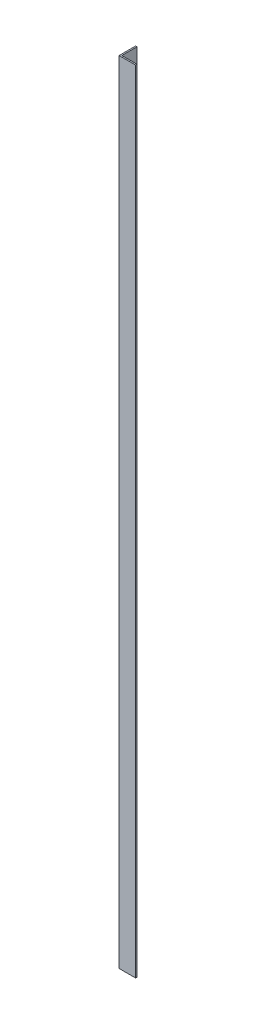
ISO-10303-21;
HEADER;
FILE_DESCRIPTION(('STEP AP214'),'2;1');
FILE_NAME('part.step','',(''),(''),'','','');
FILE_SCHEMA(('AUTOMOTIVE_DESIGN { 1 0 10303 214 1 1 1 1 }'));
ENDSEC;
DATA;
#1=APPLICATION_CONTEXT('core data for automotive mechanical design processes');
#2=APPLICATION_PROTOCOL_DEFINITION('international standard','automotive_design',2000,#1);
#3=PRODUCT_CONTEXT('',#1,'mechanical');
#4=PRODUCT('Part','Part','',(#3));
#5=PRODUCT_RELATED_PRODUCT_CATEGORY('part','',(#4));
#6=PRODUCT_DEFINITION_FORMATION('','',#4);
#7=PRODUCT_DEFINITION_CONTEXT('part definition',#1,'design');
#8=PRODUCT_DEFINITION('design','',#6,#7);
#9=PRODUCT_DEFINITION_SHAPE('','',#8);
#10=(LENGTH_UNIT() NAMED_UNIT(*) SI_UNIT(.MILLI.,.METRE.));
#11=(NAMED_UNIT(*) PLANE_ANGLE_UNIT() SI_UNIT($,.RADIAN.));
#12=(NAMED_UNIT(*) SI_UNIT($,.STERADIAN.) SOLID_ANGLE_UNIT());
#13=UNCERTAINTY_MEASURE_WITH_UNIT(LENGTH_MEASURE(1.E-05),#10,'distance_accuracy_value','');
#14=(GEOMETRIC_REPRESENTATION_CONTEXT(3) GLOBAL_UNCERTAINTY_ASSIGNED_CONTEXT((#13)) GLOBAL_UNIT_ASSIGNED_CONTEXT((#10,
#11,#12)) REPRESENTATION_CONTEXT('',''));
#15=CARTESIAN_POINT('',(0.,0.,0.));
#16=DIRECTION('',(0.,0.,1.));
#17=DIRECTION('',(1.,0.,0.));
#18=AXIS2_PLACEMENT_3D('',#15,#16,#17);
#19=CARTESIAN_POINT('',(0.,914.4,0.));
#20=DIRECTION('',(0.,0.,1.));
#21=DIRECTION('',(1.,0.,0.));
#22=AXIS2_PLACEMENT_3D('',#19,#20,#21);
#23=PLANE('',#22);
#24=DIRECTION('',(-1.,0.,0.));
#25=VECTOR('',#24,1.);
#26=CARTESIAN_POINT('',(0.,0.,0.));
#27=LINE('',#26,#25);
#28=CARTESIAN_POINT('',(1.5875,0.,0.));
#29=VERTEX_POINT('',#28);
#30=CARTESIAN_POINT('',(0.,0.,0.));
#31=VERTEX_POINT('',#30);
#32=EDGE_CURVE('E125',#29,#31,#27,.T.);
#33=ORIENTED_EDGE('',*,*,#32,.T.);
#34=DIRECTION('',(0.,-1.,0.));
#35=VECTOR('',#34,1.);
#36=CARTESIAN_POINT('',(0.,914.4,0.));
#37=LINE('',#36,#35);
#38=CARTESIAN_POINT('',(0.,914.4,0.));
#39=VERTEX_POINT('',#38);
#40=EDGE_CURVE('E11',#39,#31,#37,.T.);
#41=ORIENTED_EDGE('',*,*,#40,.F.);
#42=DIRECTION('',(-1.,0.,0.));
#43=VECTOR('',#42,1.);
#44=CARTESIAN_POINT('',(0.,914.4,0.));
#45=LINE('',#44,#43);
#46=CARTESIAN_POINT('',(1.5875,914.4,0.));
#47=VERTEX_POINT('',#46);
#48=EDGE_CURVE('E135',#47,#39,#45,.T.);
#49=ORIENTED_EDGE('',*,*,#48,.F.);
#50=DIRECTION('',(0.,-1.,0.));
#51=VECTOR('',#50,1.);
#52=CARTESIAN_POINT('',(1.5875,914.4,0.));
#53=LINE('',#52,#51);
#54=EDGE_CURVE('E121',#47,#29,#53,.T.);
#55=ORIENTED_EDGE('',*,*,#54,.T.);
#56=EDGE_LOOP('',(#33,#41,#49,#55));
#57=FACE_BOUND('',#56,.T.);
#58=ADVANCED_FACE('F41',(#57),#23,.F.);
#59=CARTESIAN_POINT('',(0.,914.4,0.));
#60=DIRECTION('',(1.,0.,0.));
#61=DIRECTION('',(0.,0.,-1.));
#62=AXIS2_PLACEMENT_3D('',#59,#60,#61);
#63=PLANE('',#62);
#64=DIRECTION('',(0.,0.,1.));
#65=VECTOR('',#64,1.);
#66=CARTESIAN_POINT('',(0.,0.,0.));
#67=LINE('',#66,#65);
#68=CARTESIAN_POINT('',(0.,0.,19.05));
#69=VERTEX_POINT('',#68);
#70=EDGE_CURVE('E128',#31,#69,#67,.T.);
#71=ORIENTED_EDGE('',*,*,#70,.T.);
#72=DIRECTION('',(0.,-1.,0.));
#73=VECTOR('',#72,1.);
#74=CARTESIAN_POINT('',(0.,914.4,19.05));
#75=LINE('',#74,#73);
#76=CARTESIAN_POINT('',(0.,914.4,19.05));
#77=VERTEX_POINT('',#76);
#78=EDGE_CURVE('E49',#77,#69,#75,.T.);
#79=ORIENTED_EDGE('',*,*,#78,.F.);
#80=DIRECTION('',(0.,0.,1.));
#81=VECTOR('',#80,1.);
#82=CARTESIAN_POINT('',(0.,914.4,0.));
#83=LINE('',#82,#81);
#84=EDGE_CURVE('E94',#39,#77,#83,.T.);
#85=ORIENTED_EDGE('',*,*,#84,.F.);
#86=ORIENTED_EDGE('',*,*,#40,.T.);
#87=EDGE_LOOP('',(#71,#79,#85,#86));
#88=FACE_BOUND('',#87,.T.);
#89=ADVANCED_FACE('F159',(#88),#63,.F.);
#90=CARTESIAN_POINT('',(0.,914.4,19.05));
#91=DIRECTION('',(0.,0.,-1.));
#92=DIRECTION('',(-1.,0.,0.));
#93=AXIS2_PLACEMENT_3D('',#90,#91,#92);
#94=PLANE('',#93);
#95=DIRECTION('',(1.,0.,0.));
#96=VECTOR('',#95,1.);
#97=CARTESIAN_POINT('',(0.,0.,19.05));
#98=LINE('',#97,#96);
#99=CARTESIAN_POINT('',(19.05,0.,19.05));
#100=VERTEX_POINT('',#99);
#101=EDGE_CURVE('E130',#69,#100,#98,.T.);
#102=ORIENTED_EDGE('',*,*,#101,.T.);
#103=DIRECTION('',(0.,-1.,0.));
#104=VECTOR('',#103,1.);
#105=CARTESIAN_POINT('',(19.05,914.4,19.05));
#106=LINE('',#105,#104);
#107=CARTESIAN_POINT('',(19.05,914.4,19.05));
#108=VERTEX_POINT('',#107);
#109=EDGE_CURVE('E116',#108,#100,#106,.T.);
#110=ORIENTED_EDGE('',*,*,#109,.F.);
#111=DIRECTION('',(1.,0.,0.));
#112=VECTOR('',#111,1.);
#113=CARTESIAN_POINT('',(0.,914.4,19.05));
#114=LINE('',#113,#112);
#115=EDGE_CURVE('E107',#77,#108,#114,.T.);
#116=ORIENTED_EDGE('',*,*,#115,.F.);
#117=ORIENTED_EDGE('',*,*,#78,.T.);
#118=EDGE_LOOP('',(#102,#110,#116,#117));
#119=FACE_BOUND('',#118,.T.);
#120=ADVANCED_FACE('F141',(#119),#94,.F.);
#121=CARTESIAN_POINT('',(19.05,914.4,19.05));
#122=DIRECTION('',(-1.,0.,0.));
#123=DIRECTION('',(0.,0.,1.));
#124=AXIS2_PLACEMENT_3D('',#121,#122,#123);
#125=PLANE('',#124);
#126=DIRECTION('',(0.,0.,-1.));
#127=VECTOR('',#126,1.);
#128=CARTESIAN_POINT('',(19.05,0.,19.05));
#129=LINE('',#128,#127);
#130=CARTESIAN_POINT('',(19.05,0.,17.4625));
#131=VERTEX_POINT('',#130);
#132=EDGE_CURVE('E115',#100,#131,#129,.T.);
#133=ORIENTED_EDGE('',*,*,#132,.T.);
#134=DIRECTION('',(0.,-1.,0.));
#135=VECTOR('',#134,1.);
#136=CARTESIAN_POINT('',(19.05,914.4,17.4625));
#137=LINE('',#136,#135);
#138=CARTESIAN_POINT('',(19.05,914.4,17.4625));
#139=VERTEX_POINT('',#138);
#140=EDGE_CURVE('E112',#139,#131,#137,.T.);
#141=ORIENTED_EDGE('',*,*,#140,.F.);
#142=DIRECTION('',(0.,0.,-1.));
#143=VECTOR('',#142,1.);
#144=CARTESIAN_POINT('',(19.05,914.4,19.05));
#145=LINE('',#144,#143);
#146=EDGE_CURVE('E101',#108,#139,#145,.T.);
#147=ORIENTED_EDGE('',*,*,#146,.F.);
#148=ORIENTED_EDGE('',*,*,#109,.T.);
#149=EDGE_LOOP('',(#133,#141,#147,#148));
#150=FACE_BOUND('',#149,.T.);
#151=ADVANCED_FACE('F113',(#150),#125,.F.);
#152=CARTESIAN_POINT('',(19.05,914.4,17.4625));
#153=DIRECTION('',(0.,0.,1.));
#154=DIRECTION('',(1.,0.,0.));
#155=AXIS2_PLACEMENT_3D('',#152,#153,#154);
#156=PLANE('',#155);
#157=DIRECTION('',(-1.,0.,0.));
#158=VECTOR('',#157,1.);
#159=CARTESIAN_POINT('',(19.05,0.,17.4625));
#160=LINE('',#159,#158);
#161=CARTESIAN_POINT('',(1.5875,0.,17.4625));
#162=VERTEX_POINT('',#161);
#163=EDGE_CURVE('E80',#131,#162,#160,.T.);
#164=ORIENTED_EDGE('',*,*,#163,.T.);
#165=DIRECTION('',(0.,-1.,0.));
#166=VECTOR('',#165,1.);
#167=CARTESIAN_POINT('',(1.5875,914.4,17.4625));
#168=LINE('',#167,#166);
#169=CARTESIAN_POINT('',(1.5875,914.4,17.4625));
#170=VERTEX_POINT('',#169);
#171=EDGE_CURVE('E117',#170,#162,#168,.T.);
#172=ORIENTED_EDGE('',*,*,#171,.F.);
#173=DIRECTION('',(-1.,0.,0.));
#174=VECTOR('',#173,1.);
#175=CARTESIAN_POINT('',(19.05,914.4,17.4625));
#176=LINE('',#175,#174);
#177=EDGE_CURVE('E105',#139,#170,#176,.T.);
#178=ORIENTED_EDGE('',*,*,#177,.F.);
#179=ORIENTED_EDGE('',*,*,#140,.T.);
#180=EDGE_LOOP('',(#164,#172,#178,#179));
#181=FACE_BOUND('',#180,.T.);
#182=ADVANCED_FACE('F119',(#181),#156,.F.);
#183=CARTESIAN_POINT('',(1.5875,914.4,17.4625));
#184=DIRECTION('',(-1.,0.,0.));
#185=DIRECTION('',(0.,0.,1.));
#186=AXIS2_PLACEMENT_3D('',#183,#184,#185);
#187=PLANE('',#186);
#188=DIRECTION('',(0.,0.,-1.));
#189=VECTOR('',#188,1.);
#190=CARTESIAN_POINT('',(1.5875,0.,17.4625));
#191=LINE('',#190,#189);
#192=EDGE_CURVE('E86',#162,#29,#191,.T.);
#193=ORIENTED_EDGE('',*,*,#192,.T.);
#194=ORIENTED_EDGE('',*,*,#54,.F.);
#195=DIRECTION('',(0.,0.,-1.));
#196=VECTOR('',#195,1.);
#197=CARTESIAN_POINT('',(1.5875,914.4,17.4625));
#198=LINE('',#197,#196);
#199=EDGE_CURVE('E57',#170,#47,#198,.T.);
#200=ORIENTED_EDGE('',*,*,#199,.F.);
#201=ORIENTED_EDGE('',*,*,#171,.T.);
#202=EDGE_LOOP('',(#193,#194,#200,#201));
#203=FACE_BOUND('',#202,.T.);
#204=ADVANCED_FACE('F148',(#203),#187,.F.);
#205=CARTESIAN_POINT('',(0.,914.4,0.));
#206=DIRECTION('',(0.,1.,0.));
#207=DIRECTION('',(0.,0.,1.));
#208=AXIS2_PLACEMENT_3D('',#205,#206,#207);
#209=PLANE('',#208);
#210=ORIENTED_EDGE('',*,*,#48,.T.);
#211=ORIENTED_EDGE('',*,*,#84,.T.);
#212=ORIENTED_EDGE('',*,*,#115,.T.);
#213=ORIENTED_EDGE('',*,*,#146,.T.);
#214=ORIENTED_EDGE('',*,*,#177,.T.);
#215=ORIENTED_EDGE('',*,*,#199,.T.);
#216=EDGE_LOOP('',(#210,#211,#212,#213,#214,#215));
#217=FACE_BOUND('',#216,.T.);
#218=ADVANCED_FACE('F103',(#217),#209,.T.);
#219=CARTESIAN_POINT('',(0.,0.,0.));
#220=DIRECTION('',(0.,1.,0.));
#221=DIRECTION('',(0.,0.,1.));
#222=AXIS2_PLACEMENT_3D('',#219,#220,#221);
#223=PLANE('',#222);
#224=ORIENTED_EDGE('',*,*,#32,.F.);
#225=ORIENTED_EDGE('',*,*,#192,.F.);
#226=ORIENTED_EDGE('',*,*,#163,.F.);
#227=ORIENTED_EDGE('',*,*,#132,.F.);
#228=ORIENTED_EDGE('',*,*,#101,.F.);
#229=ORIENTED_EDGE('',*,*,#70,.F.);
#230=EDGE_LOOP('',(#224,#225,#226,#227,#228,#229));
#231=FACE_BOUND('',#230,.T.);
#232=ADVANCED_FACE('F144',(#231),#223,.F.);
#233=CLOSED_SHELL('',(#58,#89,#120,#151,#182,#204,#218,#232));
#234=MANIFOLD_SOLID_BREP('B2',#233);
#235=ADVANCED_BREP_SHAPE_REPRESENTATION('',(#18,#234),#14);
#236=SHAPE_DEFINITION_REPRESENTATION(#9,#235);
ENDSEC;
END-ISO-10303-21;
